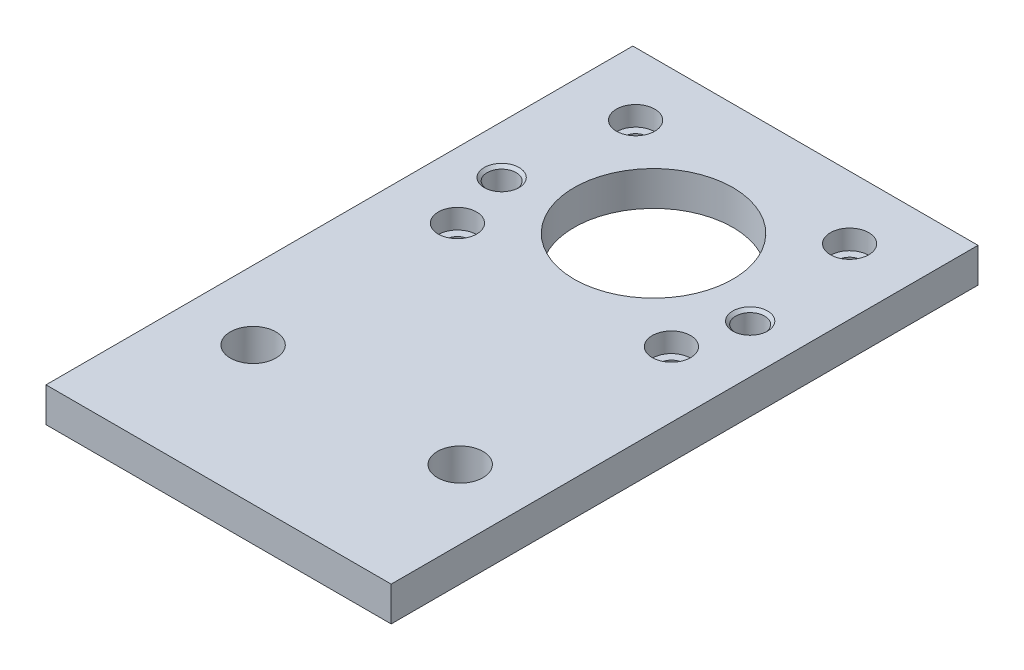
ISO-10303-21;
HEADER;
FILE_DESCRIPTION(('STEP AP214'),'2;1');
FILE_NAME('part.step','',(''),(''),'','','');
FILE_SCHEMA(('AUTOMOTIVE_DESIGN { 1 0 10303 214 1 1 1 1 }'));
ENDSEC;
DATA;
#1=APPLICATION_CONTEXT('core data for automotive mechanical design processes');
#2=APPLICATION_PROTOCOL_DEFINITION('international standard','automotive_design',2000,#1);
#3=PRODUCT_CONTEXT('',#1,'mechanical');
#4=PRODUCT('Part','Part','',(#3));
#5=PRODUCT_RELATED_PRODUCT_CATEGORY('part','',(#4));
#6=PRODUCT_DEFINITION_FORMATION('','',#4);
#7=PRODUCT_DEFINITION_CONTEXT('part definition',#1,'design');
#8=PRODUCT_DEFINITION('design','',#6,#7);
#9=PRODUCT_DEFINITION_SHAPE('','',#8);
#10=(LENGTH_UNIT() NAMED_UNIT(*) SI_UNIT(.MILLI.,.METRE.));
#11=(NAMED_UNIT(*) PLANE_ANGLE_UNIT() SI_UNIT($,.RADIAN.));
#12=(NAMED_UNIT(*) SI_UNIT($,.STERADIAN.) SOLID_ANGLE_UNIT());
#13=UNCERTAINTY_MEASURE_WITH_UNIT(LENGTH_MEASURE(1.E-05),#10,'distance_accuracy_value','');
#14=(GEOMETRIC_REPRESENTATION_CONTEXT(3) GLOBAL_UNCERTAINTY_ASSIGNED_CONTEXT((#13)) GLOBAL_UNIT_ASSIGNED_CONTEXT((#10,
#11,#12)) REPRESENTATION_CONTEXT('',''));
#15=CARTESIAN_POINT('',(0.,0.,0.));
#16=DIRECTION('',(0.,0.,1.));
#17=DIRECTION('',(1.,0.,0.));
#18=AXIS2_PLACEMENT_3D('',#15,#16,#17);
#19=CARTESIAN_POINT('',(0.,5.,-85.));
#20=DIRECTION('',(0.,-1.,0.));
#21=DIRECTION('',(0.,0.,-1.));
#22=AXIS2_PLACEMENT_3D('',#19,#20,#21);
#23=PLANE('',#22);
#24=CARTESIAN_POINT('',(43.,5.,-59.));
#25=DIRECTION('',(0.,1.,0.));
#26=DIRECTION('',(0.,0.,1.));
#27=AXIS2_PLACEMENT_3D('',#24,#25,#26);
#28=CIRCLE('',#27,2.525);
#29=CARTESIAN_POINT('',(43.,5.,-56.475));
#30=VERTEX_POINT('',#29);
#31=EDGE_CURVE('E181',#30,#30,#28,.T.);
#32=ORIENTED_EDGE('',*,*,#31,.F.);
#33=EDGE_LOOP('',(#32));
#34=FACE_BOUND('',#33,.T.);
#35=CARTESIAN_POINT('',(10.,5.,-20.));
#36=DIRECTION('',(0.,1.,0.));
#37=DIRECTION('',(0.,0.,1.));
#38=AXIS2_PLACEMENT_3D('',#35,#36,#37);
#39=CIRCLE('',#38,3.29999999999999);
#40=CARTESIAN_POINT('',(10.,5.,-16.7));
#41=VERTEX_POINT('',#40);
#42=EDGE_CURVE('E172',#41,#41,#39,.T.);
#43=ORIENTED_EDGE('',*,*,#42,.F.);
#44=EDGE_LOOP('',(#43));
#45=FACE_BOUND('',#44,.T.);
#46=CARTESIAN_POINT('',(40.,5.,-20.));
#47=DIRECTION('',(0.,1.,0.));
#48=DIRECTION('',(0.,0.,1.));
#49=AXIS2_PLACEMENT_3D('',#46,#47,#48);
#50=CIRCLE('',#49,3.29999999999999);
#51=CARTESIAN_POINT('',(40.,5.,-16.7));
#52=VERTEX_POINT('',#51);
#53=EDGE_CURVE('E166',#52,#52,#50,.T.);
#54=ORIENTED_EDGE('',*,*,#53,.F.);
#55=EDGE_LOOP('',(#54));
#56=FACE_BOUND('',#55,.T.);
#57=CARTESIAN_POINT('',(9.49999999999999,5.,-75.9033240153728));
#58=DIRECTION('',(0.,1.,0.));
#59=DIRECTION('',(0.,0.,1.));
#60=AXIS2_PLACEMENT_3D('',#57,#58,#59);
#61=CIRCLE('',#60,2.77876);
#62=CARTESIAN_POINT('',(9.49999999999999,5.,-73.1245640153728));
#63=VERTEX_POINT('',#62);
#64=EDGE_CURVE('E160',#63,#63,#61,.T.);
#65=ORIENTED_EDGE('',*,*,#64,.F.);
#66=EDGE_LOOP('',(#65));
#67=FACE_BOUND('',#66,.T.);
#68=CARTESIAN_POINT('',(9.5,5.,-50.0966759846272));
#69=DIRECTION('',(0.,1.,0.));
#70=DIRECTION('',(0.,0.,1.));
#71=AXIS2_PLACEMENT_3D('',#68,#69,#70);
#72=CIRCLE('',#71,2.77876);
#73=CARTESIAN_POINT('',(9.5,5.,-47.3179159846272));
#74=VERTEX_POINT('',#73);
#75=EDGE_CURVE('E148',#74,#74,#72,.T.);
#76=ORIENTED_EDGE('',*,*,#75,.F.);
#77=EDGE_LOOP('',(#76));
#78=FACE_BOUND('',#77,.T.);
#79=CARTESIAN_POINT('',(40.5,5.,-50.0966759846272));
#80=DIRECTION('',(0.,1.,0.));
#81=DIRECTION('',(0.,0.,1.));
#82=AXIS2_PLACEMENT_3D('',#79,#80,#81);
#83=CIRCLE('',#82,2.77876);
#84=CARTESIAN_POINT('',(40.5,5.,-47.3179159846272));
#85=VERTEX_POINT('',#84);
#86=EDGE_CURVE('E136',#85,#85,#83,.T.);
#87=ORIENTED_EDGE('',*,*,#86,.F.);
#88=EDGE_LOOP('',(#87));
#89=FACE_BOUND('',#88,.T.);
#90=CARTESIAN_POINT('',(40.5,5.,-75.9033240153728));
#91=DIRECTION('',(0.,1.,0.));
#92=DIRECTION('',(0.,0.,1.));
#93=AXIS2_PLACEMENT_3D('',#90,#91,#92);
#94=CIRCLE('',#93,2.77876);
#95=CARTESIAN_POINT('',(40.5,5.,-73.1245640153728));
#96=VERTEX_POINT('',#95);
#97=EDGE_CURVE('E124',#96,#96,#94,.T.);
#98=ORIENTED_EDGE('',*,*,#97,.F.);
#99=EDGE_LOOP('',(#98));
#100=FACE_BOUND('',#99,.T.);
#101=DIRECTION('',(0.,0.,1.));
#102=VECTOR('',#101,1.);
#103=CARTESIAN_POINT('',(0.,5.,0.));
#104=LINE('',#103,#102);
#105=CARTESIAN_POINT('',(0.,5.,-85.));
#106=VERTEX_POINT('',#105);
#107=CARTESIAN_POINT('',(0.,5.,0.));
#108=VERTEX_POINT('',#107);
#109=EDGE_CURVE('E83',#106,#108,#104,.T.);
#110=ORIENTED_EDGE('',*,*,#109,.T.);
#111=DIRECTION('',(1.,0.,0.));
#112=VECTOR('',#111,1.);
#113=CARTESIAN_POINT('',(0.,5.,0.));
#114=LINE('',#113,#112);
#115=CARTESIAN_POINT('',(50.,5.,0.));
#116=VERTEX_POINT('',#115);
#117=EDGE_CURVE('E78',#108,#116,#114,.T.);
#118=ORIENTED_EDGE('',*,*,#117,.T.);
#119=DIRECTION('',(0.,0.,-1.));
#120=VECTOR('',#119,1.);
#121=CARTESIAN_POINT('',(50.,5.,0.));
#122=LINE('',#121,#120);
#123=CARTESIAN_POINT('',(50.,5.,-85.));
#124=VERTEX_POINT('',#123);
#125=EDGE_CURVE('E81',#116,#124,#122,.T.);
#126=ORIENTED_EDGE('',*,*,#125,.T.);
#127=DIRECTION('',(-1.,0.,0.));
#128=VECTOR('',#127,1.);
#129=CARTESIAN_POINT('',(0.,5.,-85.));
#130=LINE('',#129,#128);
#131=EDGE_CURVE('E48',#124,#106,#130,.T.);
#132=ORIENTED_EDGE('',*,*,#131,.T.);
#133=EDGE_LOOP('',(#110,#118,#126,#132));
#134=FACE_BOUND('',#133,.T.);
#135=CARTESIAN_POINT('',(25.,5.,-63.));
#136=DIRECTION('',(0.,1.,0.));
#137=DIRECTION('',(0.,0.,1.));
#138=AXIS2_PLACEMENT_3D('',#135,#136,#137);
#139=CIRCLE('',#138,11.5);
#140=CARTESIAN_POINT('',(25.,5.,-51.5));
#141=VERTEX_POINT('',#140);
#142=EDGE_CURVE('E98',#141,#141,#139,.T.);
#143=ORIENTED_EDGE('',*,*,#142,.F.);
#144=EDGE_LOOP('',(#143));
#145=FACE_BOUND('',#144,.T.);
#146=CARTESIAN_POINT('',(7.,5.,-59.));
#147=DIRECTION('',(0.,1.,0.));
#148=DIRECTION('',(0.,0.,1.));
#149=AXIS2_PLACEMENT_3D('',#146,#147,#148);
#150=CIRCLE('',#149,2.525);
#151=CARTESIAN_POINT('',(7.,5.,-56.475));
#152=VERTEX_POINT('',#151);
#153=EDGE_CURVE('E190',#152,#152,#150,.T.);
#154=ORIENTED_EDGE('',*,*,#153,.F.);
#155=EDGE_LOOP('',(#154));
#156=FACE_BOUND('',#155,.T.);
#157=ADVANCED_FACE('F31',(#34,#45,#56,#67,#78,#89,#100,#134,#145,#156),#23,.F.);
#158=CARTESIAN_POINT('',(0.,0.,-85.));
#159=DIRECTION('',(0.,-1.,0.));
#160=DIRECTION('',(0.,0.,-1.));
#161=AXIS2_PLACEMENT_3D('',#158,#159,#160);
#162=PLANE('',#161);
#163=CARTESIAN_POINT('',(7.,0.,-59.));
#164=DIRECTION('',(0.,-1.,0.));
#165=DIRECTION('',(0.,0.,-1.));
#166=AXIS2_PLACEMENT_3D('',#163,#164,#165);
#167=CIRCLE('',#166,2.1);
#168=CARTESIAN_POINT('',(7.,0.,-61.1));
#169=VERTEX_POINT('',#168);
#170=EDGE_CURVE('E184',#169,#169,#167,.T.);
#171=ORIENTED_EDGE('',*,*,#170,.F.);
#172=EDGE_LOOP('',(#171));
#173=FACE_BOUND('',#172,.T.);
#174=CARTESIAN_POINT('',(43.,0.,-59.));
#175=DIRECTION('',(0.,-1.,0.));
#176=DIRECTION('',(0.,0.,-1.));
#177=AXIS2_PLACEMENT_3D('',#174,#175,#176);
#178=CIRCLE('',#177,2.1);
#179=CARTESIAN_POINT('',(43.,0.,-61.1));
#180=VERTEX_POINT('',#179);
#181=EDGE_CURVE('E175',#180,#180,#178,.T.);
#182=ORIENTED_EDGE('',*,*,#181,.F.);
#183=EDGE_LOOP('',(#182));
#184=FACE_BOUND('',#183,.T.);
#185=CARTESIAN_POINT('',(10.,0.,-20.));
#186=DIRECTION('',(0.,-1.,0.));
#187=DIRECTION('',(0.,0.,-1.));
#188=AXIS2_PLACEMENT_3D('',#185,#186,#187);
#189=CIRCLE('',#188,3.29999999999999);
#190=CARTESIAN_POINT('',(10.,0.,-23.3));
#191=VERTEX_POINT('',#190);
#192=EDGE_CURVE('E169',#191,#191,#189,.T.);
#193=ORIENTED_EDGE('',*,*,#192,.F.);
#194=EDGE_LOOP('',(#193));
#195=FACE_BOUND('',#194,.T.);
#196=CARTESIAN_POINT('',(40.,0.,-20.));
#197=DIRECTION('',(0.,-1.,0.));
#198=DIRECTION('',(0.,0.,-1.));
#199=AXIS2_PLACEMENT_3D('',#196,#197,#198);
#200=CIRCLE('',#199,3.29999999999999);
#201=CARTESIAN_POINT('',(40.,0.,-23.3));
#202=VERTEX_POINT('',#201);
#203=EDGE_CURVE('E163',#202,#202,#200,.T.);
#204=ORIENTED_EDGE('',*,*,#203,.F.);
#205=EDGE_LOOP('',(#204));
#206=FACE_BOUND('',#205,.T.);
#207=CARTESIAN_POINT('',(9.49999999999999,0.,-75.9033240153728));
#208=DIRECTION('',(0.,1.,0.));
#209=DIRECTION('',(0.,0.,1.));
#210=AXIS2_PLACEMENT_3D('',#207,#208,#209);
#211=CIRCLE('',#210,1.63195);
#212=CARTESIAN_POINT('',(9.49999999999999,0.,-74.2713740153728));
#213=VERTEX_POINT('',#212);
#214=EDGE_CURVE('E151',#213,#213,#211,.T.);
#215=ORIENTED_EDGE('',*,*,#214,.T.);
#216=EDGE_LOOP('',(#215));
#217=FACE_BOUND('',#216,.T.);
#218=CARTESIAN_POINT('',(9.5,0.,-50.0966759846272));
#219=DIRECTION('',(0.,1.,0.));
#220=DIRECTION('',(0.,0.,1.));
#221=AXIS2_PLACEMENT_3D('',#218,#219,#220);
#222=CIRCLE('',#221,1.63195);
#223=CARTESIAN_POINT('',(9.5,0.,-48.4647259846272));
#224=VERTEX_POINT('',#223);
#225=EDGE_CURVE('E139',#224,#224,#222,.T.);
#226=ORIENTED_EDGE('',*,*,#225,.T.);
#227=EDGE_LOOP('',(#226));
#228=FACE_BOUND('',#227,.T.);
#229=CARTESIAN_POINT('',(40.5,0.,-50.0966759846272));
#230=DIRECTION('',(0.,1.,0.));
#231=DIRECTION('',(0.,0.,1.));
#232=AXIS2_PLACEMENT_3D('',#229,#230,#231);
#233=CIRCLE('',#232,1.63195);
#234=CARTESIAN_POINT('',(40.5,0.,-48.4647259846272));
#235=VERTEX_POINT('',#234);
#236=EDGE_CURVE('E127',#235,#235,#233,.T.);
#237=ORIENTED_EDGE('',*,*,#236,.T.);
#238=EDGE_LOOP('',(#237));
#239=FACE_BOUND('',#238,.T.);
#240=CARTESIAN_POINT('',(40.5,0.,-75.9033240153728));
#241=DIRECTION('',(0.,1.,0.));
#242=DIRECTION('',(0.,0.,1.));
#243=AXIS2_PLACEMENT_3D('',#240,#241,#242);
#244=CIRCLE('',#243,1.63195);
#245=CARTESIAN_POINT('',(40.5,0.,-74.2713740153728));
#246=VERTEX_POINT('',#245);
#247=EDGE_CURVE('E113',#246,#246,#244,.T.);
#248=ORIENTED_EDGE('',*,*,#247,.T.);
#249=EDGE_LOOP('',(#248));
#250=FACE_BOUND('',#249,.T.);
#251=DIRECTION('',(0.,0.,1.));
#252=VECTOR('',#251,1.);
#253=CARTESIAN_POINT('',(0.,0.,0.));
#254=LINE('',#253,#252);
#255=CARTESIAN_POINT('',(0.,0.,-85.));
#256=VERTEX_POINT('',#255);
#257=CARTESIAN_POINT('',(0.,0.,0.));
#258=VERTEX_POINT('',#257);
#259=EDGE_CURVE('E95',#256,#258,#254,.T.);
#260=ORIENTED_EDGE('',*,*,#259,.F.);
#261=DIRECTION('',(-1.,0.,0.));
#262=VECTOR('',#261,1.);
#263=CARTESIAN_POINT('',(0.,0.,-85.));
#264=LINE('',#263,#262);
#265=CARTESIAN_POINT('',(50.,0.,-85.));
#266=VERTEX_POINT('',#265);
#267=EDGE_CURVE('E71',#266,#256,#264,.T.);
#268=ORIENTED_EDGE('',*,*,#267,.F.);
#269=DIRECTION('',(0.,0.,-1.));
#270=VECTOR('',#269,1.);
#271=CARTESIAN_POINT('',(50.,0.,0.));
#272=LINE('',#271,#270);
#273=CARTESIAN_POINT('',(50.,0.,0.));
#274=VERTEX_POINT('',#273);
#275=EDGE_CURVE('E65',#274,#266,#272,.T.);
#276=ORIENTED_EDGE('',*,*,#275,.F.);
#277=DIRECTION('',(1.,0.,0.));
#278=VECTOR('',#277,1.);
#279=CARTESIAN_POINT('',(0.,0.,0.));
#280=LINE('',#279,#278);
#281=EDGE_CURVE('E87',#258,#274,#280,.T.);
#282=ORIENTED_EDGE('',*,*,#281,.F.);
#283=EDGE_LOOP('',(#260,#268,#276,#282));
#284=FACE_BOUND('',#283,.T.);
#285=CARTESIAN_POINT('',(25.,0.,-63.));
#286=DIRECTION('',(0.,1.,0.));
#287=DIRECTION('',(0.,0.,1.));
#288=AXIS2_PLACEMENT_3D('',#285,#286,#287);
#289=CIRCLE('',#288,11.5);
#290=CARTESIAN_POINT('',(25.,0.,-51.5));
#291=VERTEX_POINT('',#290);
#292=EDGE_CURVE('E110',#291,#291,#289,.T.);
#293=ORIENTED_EDGE('',*,*,#292,.T.);
#294=EDGE_LOOP('',(#293));
#295=FACE_BOUND('',#294,.T.);
#296=ADVANCED_FACE('F106',(#173,#184,#195,#206,#217,#228,#239,#250,#284,#295),#162,.T.);
#297=CARTESIAN_POINT('',(0.,5.,0.));
#298=DIRECTION('',(1.,0.,0.));
#299=DIRECTION('',(0.,0.,-1.));
#300=AXIS2_PLACEMENT_3D('',#297,#298,#299);
#301=PLANE('',#300);
#302=ORIENTED_EDGE('',*,*,#259,.T.);
#303=DIRECTION('',(0.,-1.,0.));
#304=VECTOR('',#303,1.);
#305=CARTESIAN_POINT('',(0.,5.,0.));
#306=LINE('',#305,#304);
#307=EDGE_CURVE('E11',#108,#258,#306,.T.);
#308=ORIENTED_EDGE('',*,*,#307,.F.);
#309=ORIENTED_EDGE('',*,*,#109,.F.);
#310=DIRECTION('',(0.,-1.,0.));
#311=VECTOR('',#310,1.);
#312=CARTESIAN_POINT('',(0.,5.,-85.));
#313=LINE('',#312,#311);
#314=EDGE_CURVE('E91',#106,#256,#313,.T.);
#315=ORIENTED_EDGE('',*,*,#314,.T.);
#316=EDGE_LOOP('',(#302,#308,#309,#315));
#317=FACE_BOUND('',#316,.T.);
#318=ADVANCED_FACE('F33',(#317),#301,.F.);
#319=CARTESIAN_POINT('',(0.,5.,0.));
#320=DIRECTION('',(0.,0.,-1.));
#321=DIRECTION('',(-1.,0.,0.));
#322=AXIS2_PLACEMENT_3D('',#319,#320,#321);
#323=PLANE('',#322);
#324=ORIENTED_EDGE('',*,*,#281,.T.);
#325=DIRECTION('',(0.,-1.,0.));
#326=VECTOR('',#325,1.);
#327=CARTESIAN_POINT('',(50.,5.,0.));
#328=LINE('',#327,#326);
#329=EDGE_CURVE('E40',#116,#274,#328,.T.);
#330=ORIENTED_EDGE('',*,*,#329,.F.);
#331=ORIENTED_EDGE('',*,*,#117,.F.);
#332=ORIENTED_EDGE('',*,*,#307,.T.);
#333=EDGE_LOOP('',(#324,#330,#331,#332));
#334=FACE_BOUND('',#333,.T.);
#335=ADVANCED_FACE('F86',(#334),#323,.F.);
#336=CARTESIAN_POINT('',(50.,5.,0.));
#337=DIRECTION('',(-1.,0.,0.));
#338=DIRECTION('',(0.,0.,1.));
#339=AXIS2_PLACEMENT_3D('',#336,#337,#338);
#340=PLANE('',#339);
#341=ORIENTED_EDGE('',*,*,#275,.T.);
#342=DIRECTION('',(0.,-1.,0.));
#343=VECTOR('',#342,1.);
#344=CARTESIAN_POINT('',(50.,5.,-85.));
#345=LINE('',#344,#343);
#346=EDGE_CURVE('E88',#124,#266,#345,.T.);
#347=ORIENTED_EDGE('',*,*,#346,.F.);
#348=ORIENTED_EDGE('',*,*,#125,.F.);
#349=ORIENTED_EDGE('',*,*,#329,.T.);
#350=EDGE_LOOP('',(#341,#347,#348,#349));
#351=FACE_BOUND('',#350,.T.);
#352=ADVANCED_FACE('F89',(#351),#340,.F.);
#353=CARTESIAN_POINT('',(0.,5.,-85.));
#354=DIRECTION('',(0.,0.,1.));
#355=DIRECTION('',(1.,0.,0.));
#356=AXIS2_PLACEMENT_3D('',#353,#354,#355);
#357=PLANE('',#356);
#358=ORIENTED_EDGE('',*,*,#267,.T.);
#359=ORIENTED_EDGE('',*,*,#314,.F.);
#360=ORIENTED_EDGE('',*,*,#131,.F.);
#361=ORIENTED_EDGE('',*,*,#346,.T.);
#362=EDGE_LOOP('',(#358,#359,#360,#361));
#363=FACE_BOUND('',#362,.T.);
#364=ADVANCED_FACE('F103',(#363),#357,.F.);
#365=CARTESIAN_POINT('',(25.,5.,-63.));
#366=DIRECTION('',(0.,-1.,0.));
#367=DIRECTION('',(0.,0.,-1.));
#368=AXIS2_PLACEMENT_3D('',#365,#366,#367);
#369=CYLINDRICAL_SURFACE('',#368,11.5);
#370=ORIENTED_EDGE('',*,*,#142,.T.);
#371=EDGE_LOOP('',(#370));
#372=FACE_BOUND('',#371,.T.);
#373=ORIENTED_EDGE('',*,*,#292,.F.);
#374=EDGE_LOOP('',(#373));
#375=FACE_BOUND('',#374,.T.);
#376=ADVANCED_FACE('F207',(#372,#375),#369,.F.);
#377=CARTESIAN_POINT('',(40.5,5.,-75.9033240153728));
#378=DIRECTION('',(0.,1.,0.));
#379=DIRECTION('',(0.,0.,1.));
#380=AXIS2_PLACEMENT_3D('',#377,#378,#379);
#381=CYLINDRICAL_SURFACE('',#380,1.63195);
#382=ORIENTED_EDGE('',*,*,#247,.F.);
#383=EDGE_LOOP('',(#382));
#384=FACE_BOUND('',#383,.T.);
#385=CARTESIAN_POINT('',(40.5,2.1552,-75.9033240153728));
#386=DIRECTION('',(0.,1.,0.));
#387=DIRECTION('',(0.,0.,1.));
#388=AXIS2_PLACEMENT_3D('',#385,#386,#387);
#389=CIRCLE('',#388,1.63195);
#390=CARTESIAN_POINT('',(40.5,2.1552,-74.2713740153728));
#391=VERTEX_POINT('',#390);
#392=EDGE_CURVE('E118',#391,#391,#389,.T.);
#393=ORIENTED_EDGE('',*,*,#392,.T.);
#394=EDGE_LOOP('',(#393));
#395=FACE_BOUND('',#394,.T.);
#396=ADVANCED_FACE('F321',(#384,#395),#381,.F.);
#397=CARTESIAN_POINT('',(42.13195,2.1552,-75.9033240153728));
#398=DIRECTION('',(0.,-1.,0.));
#399=DIRECTION('',(0.,0.,-1.));
#400=AXIS2_PLACEMENT_3D('',#397,#398,#399);
#401=PLANE('',#400);
#402=ORIENTED_EDGE('',*,*,#392,.F.);
#403=EDGE_LOOP('',(#402));
#404=FACE_BOUND('',#403,.T.);
#405=CARTESIAN_POINT('',(40.5,2.1552,-75.9033240153728));
#406=DIRECTION('',(0.,1.,0.));
#407=DIRECTION('',(0.,0.,1.));
#408=AXIS2_PLACEMENT_3D('',#405,#406,#407);
#409=CIRCLE('',#408,2.77876);
#410=CARTESIAN_POINT('',(40.5,2.1552,-73.1245640153728));
#411=VERTEX_POINT('',#410);
#412=EDGE_CURVE('E121',#411,#411,#409,.T.);
#413=ORIENTED_EDGE('',*,*,#412,.T.);
#414=EDGE_LOOP('',(#413));
#415=FACE_BOUND('',#414,.T.);
#416=ADVANCED_FACE('F318',(#404,#415),#401,.F.);
#417=CARTESIAN_POINT('',(40.5,5.,-75.9033240153728));
#418=DIRECTION('',(0.,1.,0.));
#419=DIRECTION('',(0.,0.,1.));
#420=AXIS2_PLACEMENT_3D('',#417,#418,#419);
#421=CYLINDRICAL_SURFACE('',#420,2.77876);
#422=ORIENTED_EDGE('',*,*,#412,.F.);
#423=EDGE_LOOP('',(#422));
#424=FACE_BOUND('',#423,.T.);
#425=ORIENTED_EDGE('',*,*,#97,.T.);
#426=EDGE_LOOP('',(#425));
#427=FACE_BOUND('',#426,.T.);
#428=ADVANCED_FACE('F314',(#424,#427),#421,.F.);
#429=CARTESIAN_POINT('',(40.5,5.,-50.0966759846272));
#430=DIRECTION('',(0.,1.,0.));
#431=DIRECTION('',(0.,0.,1.));
#432=AXIS2_PLACEMENT_3D('',#429,#430,#431);
#433=CYLINDRICAL_SURFACE('',#432,1.63195);
#434=ORIENTED_EDGE('',*,*,#236,.F.);
#435=EDGE_LOOP('',(#434));
#436=FACE_BOUND('',#435,.T.);
#437=CARTESIAN_POINT('',(40.5,2.1552,-50.0966759846272));
#438=DIRECTION('',(0.,1.,0.));
#439=DIRECTION('',(0.,0.,1.));
#440=AXIS2_PLACEMENT_3D('',#437,#438,#439);
#441=CIRCLE('',#440,1.63195);
#442=CARTESIAN_POINT('',(40.5,2.1552,-48.4647259846272));
#443=VERTEX_POINT('',#442);
#444=EDGE_CURVE('E130',#443,#443,#441,.T.);
#445=ORIENTED_EDGE('',*,*,#444,.T.);
#446=EDGE_LOOP('',(#445));
#447=FACE_BOUND('',#446,.T.);
#448=ADVANCED_FACE('F310',(#436,#447),#433,.F.);
#449=CARTESIAN_POINT('',(42.13195,2.1552,-50.0966759846272));
#450=DIRECTION('',(0.,-1.,0.));
#451=DIRECTION('',(0.,0.,-1.));
#452=AXIS2_PLACEMENT_3D('',#449,#450,#451);
#453=PLANE('',#452);
#454=ORIENTED_EDGE('',*,*,#444,.F.);
#455=EDGE_LOOP('',(#454));
#456=FACE_BOUND('',#455,.T.);
#457=CARTESIAN_POINT('',(40.5,2.1552,-50.0966759846272));
#458=DIRECTION('',(0.,1.,0.));
#459=DIRECTION('',(0.,0.,1.));
#460=AXIS2_PLACEMENT_3D('',#457,#458,#459);
#461=CIRCLE('',#460,2.77876);
#462=CARTESIAN_POINT('',(40.5,2.1552,-47.3179159846272));
#463=VERTEX_POINT('',#462);
#464=EDGE_CURVE('E133',#463,#463,#461,.T.);
#465=ORIENTED_EDGE('',*,*,#464,.T.);
#466=EDGE_LOOP('',(#465));
#467=FACE_BOUND('',#466,.T.);
#468=ADVANCED_FACE('F306',(#456,#467),#453,.F.);
#469=CARTESIAN_POINT('',(40.5,5.,-50.0966759846272));
#470=DIRECTION('',(0.,1.,0.));
#471=DIRECTION('',(0.,0.,1.));
#472=AXIS2_PLACEMENT_3D('',#469,#470,#471);
#473=CYLINDRICAL_SURFACE('',#472,2.77876);
#474=ORIENTED_EDGE('',*,*,#464,.F.);
#475=EDGE_LOOP('',(#474));
#476=FACE_BOUND('',#475,.T.);
#477=ORIENTED_EDGE('',*,*,#86,.T.);
#478=EDGE_LOOP('',(#477));
#479=FACE_BOUND('',#478,.T.);
#480=ADVANCED_FACE('F302',(#476,#479),#473,.F.);
#481=CARTESIAN_POINT('',(9.5,5.,-50.0966759846272));
#482=DIRECTION('',(0.,1.,0.));
#483=DIRECTION('',(0.,0.,1.));
#484=AXIS2_PLACEMENT_3D('',#481,#482,#483);
#485=CYLINDRICAL_SURFACE('',#484,1.63195);
#486=ORIENTED_EDGE('',*,*,#225,.F.);
#487=EDGE_LOOP('',(#486));
#488=FACE_BOUND('',#487,.T.);
#489=CARTESIAN_POINT('',(9.5,2.1552,-50.0966759846272));
#490=DIRECTION('',(0.,1.,0.));
#491=DIRECTION('',(0.,0.,1.));
#492=AXIS2_PLACEMENT_3D('',#489,#490,#491);
#493=CIRCLE('',#492,1.63195);
#494=CARTESIAN_POINT('',(9.5,2.1552,-48.4647259846272));
#495=VERTEX_POINT('',#494);
#496=EDGE_CURVE('E142',#495,#495,#493,.T.);
#497=ORIENTED_EDGE('',*,*,#496,.T.);
#498=EDGE_LOOP('',(#497));
#499=FACE_BOUND('',#498,.T.);
#500=ADVANCED_FACE('F298',(#488,#499),#485,.F.);
#501=CARTESIAN_POINT('',(11.13195,2.1552,-50.0966759846272));
#502=DIRECTION('',(0.,-1.,0.));
#503=DIRECTION('',(0.,0.,-1.));
#504=AXIS2_PLACEMENT_3D('',#501,#502,#503);
#505=PLANE('',#504);
#506=ORIENTED_EDGE('',*,*,#496,.F.);
#507=EDGE_LOOP('',(#506));
#508=FACE_BOUND('',#507,.T.);
#509=CARTESIAN_POINT('',(9.5,2.1552,-50.0966759846272));
#510=DIRECTION('',(0.,1.,0.));
#511=DIRECTION('',(0.,0.,1.));
#512=AXIS2_PLACEMENT_3D('',#509,#510,#511);
#513=CIRCLE('',#512,2.77876);
#514=CARTESIAN_POINT('',(9.5,2.1552,-47.3179159846272));
#515=VERTEX_POINT('',#514);
#516=EDGE_CURVE('E145',#515,#515,#513,.T.);
#517=ORIENTED_EDGE('',*,*,#516,.T.);
#518=EDGE_LOOP('',(#517));
#519=FACE_BOUND('',#518,.T.);
#520=ADVANCED_FACE('F294',(#508,#519),#505,.F.);
#521=CARTESIAN_POINT('',(9.5,5.,-50.0966759846272));
#522=DIRECTION('',(0.,1.,0.));
#523=DIRECTION('',(0.,0.,1.));
#524=AXIS2_PLACEMENT_3D('',#521,#522,#523);
#525=CYLINDRICAL_SURFACE('',#524,2.77876);
#526=ORIENTED_EDGE('',*,*,#516,.F.);
#527=EDGE_LOOP('',(#526));
#528=FACE_BOUND('',#527,.T.);
#529=ORIENTED_EDGE('',*,*,#75,.T.);
#530=EDGE_LOOP('',(#529));
#531=FACE_BOUND('',#530,.T.);
#532=ADVANCED_FACE('F290',(#528,#531),#525,.F.);
#533=CARTESIAN_POINT('',(9.49999999999999,5.,-75.9033240153728));
#534=DIRECTION('',(0.,1.,0.));
#535=DIRECTION('',(0.,0.,1.));
#536=AXIS2_PLACEMENT_3D('',#533,#534,#535);
#537=CYLINDRICAL_SURFACE('',#536,1.63195);
#538=ORIENTED_EDGE('',*,*,#214,.F.);
#539=EDGE_LOOP('',(#538));
#540=FACE_BOUND('',#539,.T.);
#541=CARTESIAN_POINT('',(9.49999999999999,2.1552,-75.9033240153728));
#542=DIRECTION('',(0.,1.,0.));
#543=DIRECTION('',(0.,0.,1.));
#544=AXIS2_PLACEMENT_3D('',#541,#542,#543);
#545=CIRCLE('',#544,1.63195);
#546=CARTESIAN_POINT('',(9.49999999999999,2.1552,-74.2713740153728));
#547=VERTEX_POINT('',#546);
#548=EDGE_CURVE('E154',#547,#547,#545,.T.);
#549=ORIENTED_EDGE('',*,*,#548,.T.);
#550=EDGE_LOOP('',(#549));
#551=FACE_BOUND('',#550,.T.);
#552=ADVANCED_FACE('F286',(#540,#551),#537,.F.);
#553=CARTESIAN_POINT('',(11.13195,2.1552,-75.9033240153728));
#554=DIRECTION('',(0.,-1.,0.));
#555=DIRECTION('',(0.,0.,-1.));
#556=AXIS2_PLACEMENT_3D('',#553,#554,#555);
#557=PLANE('',#556);
#558=ORIENTED_EDGE('',*,*,#548,.F.);
#559=EDGE_LOOP('',(#558));
#560=FACE_BOUND('',#559,.T.);
#561=CARTESIAN_POINT('',(9.49999999999999,2.1552,-75.9033240153728));
#562=DIRECTION('',(0.,1.,0.));
#563=DIRECTION('',(0.,0.,1.));
#564=AXIS2_PLACEMENT_3D('',#561,#562,#563);
#565=CIRCLE('',#564,2.77876);
#566=CARTESIAN_POINT('',(9.49999999999999,2.1552,-73.1245640153728));
#567=VERTEX_POINT('',#566);
#568=EDGE_CURVE('E157',#567,#567,#565,.T.);
#569=ORIENTED_EDGE('',*,*,#568,.T.);
#570=EDGE_LOOP('',(#569));
#571=FACE_BOUND('',#570,.T.);
#572=ADVANCED_FACE('F282',(#560,#571),#557,.F.);
#573=CARTESIAN_POINT('',(9.49999999999999,5.,-75.9033240153728));
#574=DIRECTION('',(0.,1.,0.));
#575=DIRECTION('',(0.,0.,1.));
#576=AXIS2_PLACEMENT_3D('',#573,#574,#575);
#577=CYLINDRICAL_SURFACE('',#576,2.77876);
#578=ORIENTED_EDGE('',*,*,#568,.F.);
#579=EDGE_LOOP('',(#578));
#580=FACE_BOUND('',#579,.T.);
#581=ORIENTED_EDGE('',*,*,#64,.T.);
#582=EDGE_LOOP('',(#581));
#583=FACE_BOUND('',#582,.T.);
#584=ADVANCED_FACE('F278',(#580,#583),#577,.F.);
#585=CARTESIAN_POINT('',(40.,5.,-20.));
#586=DIRECTION('',(0.,1.,0.));
#587=DIRECTION('',(0.,0.,1.));
#588=AXIS2_PLACEMENT_3D('',#585,#586,#587);
#589=CYLINDRICAL_SURFACE('',#588,3.29999999999999);
#590=ORIENTED_EDGE('',*,*,#53,.T.);
#591=EDGE_LOOP('',(#590));
#592=FACE_BOUND('',#591,.T.);
#593=ORIENTED_EDGE('',*,*,#203,.T.);
#594=EDGE_LOOP('',(#593));
#595=FACE_BOUND('',#594,.T.);
#596=ADVANCED_FACE('F274',(#592,#595),#589,.F.);
#597=CARTESIAN_POINT('',(10.,5.,-20.));
#598=DIRECTION('',(0.,1.,0.));
#599=DIRECTION('',(0.,0.,1.));
#600=AXIS2_PLACEMENT_3D('',#597,#598,#599);
#601=CYLINDRICAL_SURFACE('',#600,3.29999999999999);
#602=ORIENTED_EDGE('',*,*,#42,.T.);
#603=EDGE_LOOP('',(#602));
#604=FACE_BOUND('',#603,.T.);
#605=ORIENTED_EDGE('',*,*,#192,.T.);
#606=EDGE_LOOP('',(#605));
#607=FACE_BOUND('',#606,.T.);
#608=ADVANCED_FACE('F237',(#604,#607),#601,.F.);
#609=CARTESIAN_POINT('',(43.,5.,-59.));
#610=DIRECTION('',(0.,1.,0.));
#611=DIRECTION('',(0.,0.,1.));
#612=AXIS2_PLACEMENT_3D('',#609,#610,#611);
#613=CYLINDRICAL_SURFACE('',#612,2.1);
#614=CARTESIAN_POINT('',(43.,4.575,-59.));
#615=DIRECTION('',(0.,1.,0.));
#616=DIRECTION('',(0.,0.,1.));
#617=AXIS2_PLACEMENT_3D('',#614,#615,#616);
#618=CIRCLE('',#617,2.1);
#619=CARTESIAN_POINT('',(43.,4.575,-56.9));
#620=VERTEX_POINT('',#619);
#621=EDGE_CURVE('E178',#620,#620,#618,.T.);
#622=ORIENTED_EDGE('',*,*,#621,.T.);
#623=EDGE_LOOP('',(#622));
#624=FACE_BOUND('',#623,.T.);
#625=ORIENTED_EDGE('',*,*,#181,.T.);
#626=EDGE_LOOP('',(#625));
#627=FACE_BOUND('',#626,.T.);
#628=ADVANCED_FACE('F231',(#624,#627),#613,.F.);
#629=CARTESIAN_POINT('',(43.,5.,-59.));
#630=DIRECTION('',(0.,1.,0.));
#631=DIRECTION('',(0.,0.,1.));
#632=AXIS2_PLACEMENT_3D('',#629,#630,#631);
#633=CONICAL_SURFACE('',#632,2.525,0.78539816339745);
#634=ORIENTED_EDGE('',*,*,#621,.F.);
#635=EDGE_LOOP('',(#634));
#636=FACE_BOUND('',#635,.T.);
#637=ORIENTED_EDGE('',*,*,#31,.T.);
#638=EDGE_LOOP('',(#637));
#639=FACE_BOUND('',#638,.T.);
#640=ADVANCED_FACE('F236',(#636,#639),#633,.F.);
#641=CARTESIAN_POINT('',(7.,5.,-59.));
#642=DIRECTION('',(0.,1.,0.));
#643=DIRECTION('',(0.,0.,1.));
#644=AXIS2_PLACEMENT_3D('',#641,#642,#643);
#645=CYLINDRICAL_SURFACE('',#644,2.1);
#646=CARTESIAN_POINT('',(7.,4.575,-59.));
#647=DIRECTION('',(0.,1.,0.));
#648=DIRECTION('',(0.,0.,1.));
#649=AXIS2_PLACEMENT_3D('',#646,#647,#648);
#650=CIRCLE('',#649,2.1);
#651=CARTESIAN_POINT('',(7.,4.575,-56.9));
#652=VERTEX_POINT('',#651);
#653=EDGE_CURVE('E187',#652,#652,#650,.T.);
#654=ORIENTED_EDGE('',*,*,#653,.T.);
#655=EDGE_LOOP('',(#654));
#656=FACE_BOUND('',#655,.T.);
#657=ORIENTED_EDGE('',*,*,#170,.T.);
#658=EDGE_LOOP('',(#657));
#659=FACE_BOUND('',#658,.T.);
#660=ADVANCED_FACE('F248',(#656,#659),#645,.F.);
#661=CARTESIAN_POINT('',(7.,5.,-59.));
#662=DIRECTION('',(0.,1.,0.));
#663=DIRECTION('',(0.,0.,1.));
#664=AXIS2_PLACEMENT_3D('',#661,#662,#663);
#665=CONICAL_SURFACE('',#664,2.525,0.78539816339745);
#666=ORIENTED_EDGE('',*,*,#653,.F.);
#667=EDGE_LOOP('',(#666));
#668=FACE_BOUND('',#667,.T.);
#669=ORIENTED_EDGE('',*,*,#153,.T.);
#670=EDGE_LOOP('',(#669));
#671=FACE_BOUND('',#670,.T.);
#672=ADVANCED_FACE('F194',(#668,#671),#665,.F.);
#673=CLOSED_SHELL('',(#157,#296,#318,#335,#352,#364,#376,#396,#416,#428,#448,#468,#480,#500,
#520,#532,#552,#572,#584,#596,#608,#628,#640,#660,#672));
#674=MANIFOLD_SOLID_BREP('B2',#673);
#675=ADVANCED_BREP_SHAPE_REPRESENTATION('',(#18,#674),#14);
#676=SHAPE_DEFINITION_REPRESENTATION(#9,#675);
ENDSEC;
END-ISO-10303-21;
